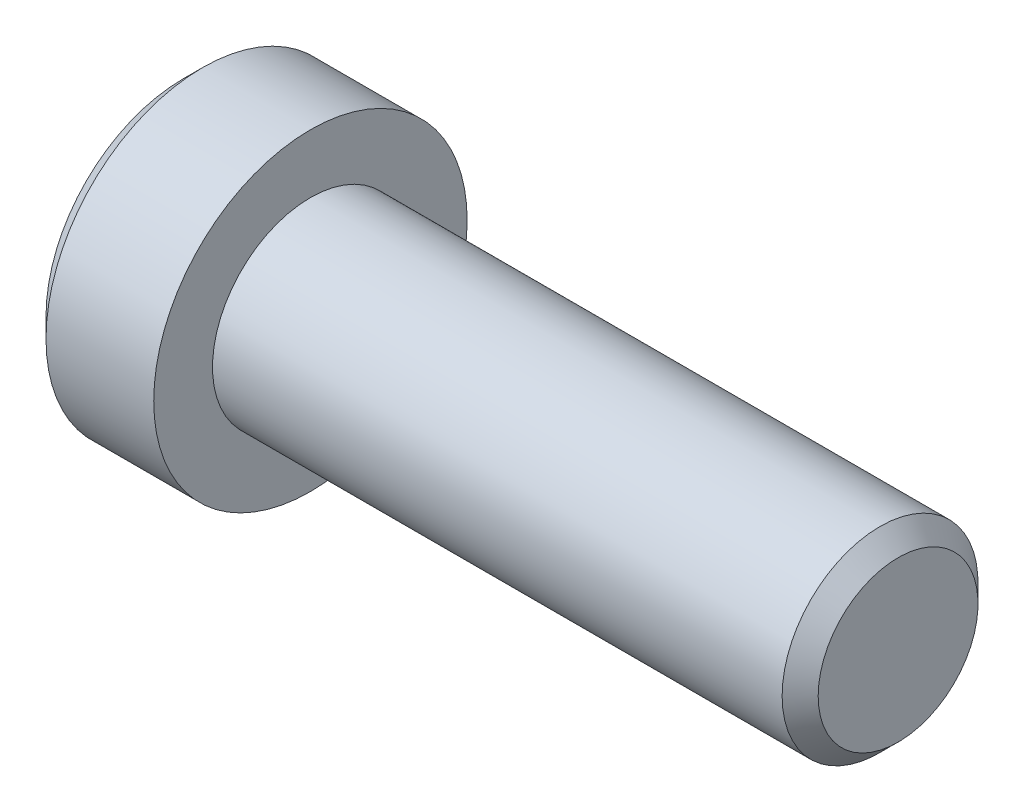
ISO-10303-21;
HEADER;
FILE_DESCRIPTION(('STEP AP214'),'2;1');
FILE_NAME('part.step','',(''),(''),'','','');
FILE_SCHEMA(('AUTOMOTIVE_DESIGN { 1 0 10303 214 1 1 1 1 }'));
ENDSEC;
DATA;
#1=APPLICATION_CONTEXT('core data for automotive mechanical design processes');
#2=APPLICATION_PROTOCOL_DEFINITION('international standard','automotive_design',2000,#1);
#3=PRODUCT_CONTEXT('',#1,'mechanical');
#4=PRODUCT('Part','Part','',(#3));
#5=PRODUCT_RELATED_PRODUCT_CATEGORY('part','',(#4));
#6=PRODUCT_DEFINITION_FORMATION('','',#4);
#7=PRODUCT_DEFINITION_CONTEXT('part definition',#1,'design');
#8=PRODUCT_DEFINITION('design','',#6,#7);
#9=PRODUCT_DEFINITION_SHAPE('','',#8);
#10=(LENGTH_UNIT() NAMED_UNIT(*) SI_UNIT(.MILLI.,.METRE.));
#11=(NAMED_UNIT(*) PLANE_ANGLE_UNIT() SI_UNIT($,.RADIAN.));
#12=(NAMED_UNIT(*) SI_UNIT($,.STERADIAN.) SOLID_ANGLE_UNIT());
#13=UNCERTAINTY_MEASURE_WITH_UNIT(LENGTH_MEASURE(1.E-05),#10,'distance_accuracy_value','');
#14=(GEOMETRIC_REPRESENTATION_CONTEXT(3) GLOBAL_UNCERTAINTY_ASSIGNED_CONTEXT((#13)) GLOBAL_UNIT_ASSIGNED_CONTEXT((#10,
#11,#12)) REPRESENTATION_CONTEXT('',''));
#15=CARTESIAN_POINT('',(0.,0.,0.));
#16=DIRECTION('',(0.,0.,1.));
#17=DIRECTION('',(1.,0.,0.));
#18=AXIS2_PLACEMENT_3D('',#15,#16,#17);
#19=CARTESIAN_POINT('',(0.999999999976353,0.,0.));
#20=DIRECTION('',(-1.,0.,0.));
#21=DIRECTION('',(0.,0.,1.));
#22=AXIS2_PLACEMENT_3D('',#19,#20,#21);
#23=CONICAL_SURFACE('',#22,2.50000000005457,1.04719755117819);
#24=CARTESIAN_POINT('',(2.44337567301045,-5.6843418860808E-11,0.));
#25=VERTEX_POINT('',#24);
#26=VERTEX_LOOP('',#25);
#27=FACE_BOUND('',#26,.T.);
#28=CARTESIAN_POINT('',(1.,0.,0.));
#29=DIRECTION('',(1.,0.,0.));
#30=DIRECTION('',(0.,1.,0.));
#31=AXIS2_PLACEMENT_3D('',#28,#29,#30);
#32=CIRCLE('',#31,2.5);
#33=CARTESIAN_POINT('',(1.,2.5,0.));
#34=VERTEX_POINT('',#33);
#35=EDGE_CURVE('E107',#34,#34,#32,.F.);
#36=ORIENTED_EDGE('',*,*,#35,.T.);
#37=EDGE_LOOP('',(#36));
#38=FACE_BOUND('',#37,.T.);
#39=ADVANCED_FACE('F17',(#27,#38),#23,.F.);
#40=CARTESIAN_POINT('',(-0.388354503153696,0.,0.));
#41=DIRECTION('',(1.,0.,0.));
#42=DIRECTION('',(0.,1.,0.));
#43=AXIS2_PLACEMENT_3D('',#40,#41,#42);
#44=CYLINDRICAL_SURFACE('',#43,2.5);
#45=ORIENTED_EDGE('',*,*,#35,.F.);
#46=EDGE_LOOP('',(#45));
#47=FACE_BOUND('',#46,.T.);
#48=CARTESIAN_POINT('',(-1.77670900626481,0.,0.));
#49=DIRECTION('',(-1.,0.,0.));
#50=DIRECTION('',(0.,1.,0.));
#51=AXIS2_PLACEMENT_3D('',#48,#49,#50);
#52=CIRCLE('',#51,2.49999999999773);
#53=CARTESIAN_POINT('',(-1.77670900626481,2.49999999999773,0.));
#54=VERTEX_POINT('',#53);
#55=EDGE_CURVE('E85',#54,#54,#52,.T.);
#56=ORIENTED_EDGE('',*,*,#55,.T.);
#57=EDGE_LOOP('',(#56));
#58=FACE_BOUND('',#57,.T.);
#59=ADVANCED_FACE('F170',(#47,#58),#44,.F.);
#60=CARTESIAN_POINT('',(-3.00733974592049,0.,0.));
#61=DIRECTION('',(-1.,0.,0.));
#62=DIRECTION('',(0.,0.,1.));
#63=AXIS2_PLACEMENT_3D('',#60,#61,#62);
#64=CONICAL_SURFACE('',#63,4.63151496643377,1.04719755119585);
#65=ORIENTED_EDGE('',*,*,#55,.F.);
#66=EDGE_LOOP('',(#65));
#67=FACE_BOUND('',#66,.T.);
#68=CARTESIAN_POINT('',(-2.99999999996384,4.,2.30940107676894));
#69=CARTESIAN_POINT('',(-2.94139109021679,4.,2.10643269459662));
#70=CARTESIAN_POINT('',(-2.88808935416355,4.,1.90171229223685));
#71=CARTESIAN_POINT('',(-2.79505277476292,4.,1.48872689069175));
#72=CARTESIAN_POINT('',(-2.75535084063822,4.,1.28045455594373));
#73=CARTESIAN_POINT('',(-2.69355191785354,4.,0.866490901087552));
#74=CARTESIAN_POINT('',(-2.67104357515487,4.,0.660863256751594));
#75=CARTESIAN_POINT('',(-2.64417833622137,4.,0.248640926862069));
#76=CARTESIAN_POINT('',(-2.63979918790862,4.,0.0420477385965077));
#77=CARTESIAN_POINT('',(-2.64893258026943,4.,-0.343949470895996));
#78=CARTESIAN_POINT('',(-2.66020257039234,4.,-0.523411414148852));
#79=CARTESIAN_POINT('',(-2.69591460139636,4.,-0.881166164633634));
#80=CARTESIAN_POINT('',(-2.72036882949761,4.,-1.05945773541097));
#81=CARTESIAN_POINT('',(-2.78149966663764,4.,-1.41794949442067));
#82=CARTESIAN_POINT('',(-2.81843528439806,4.,-1.59810433357154));
#83=CARTESIAN_POINT('',(-2.90226352164124,4.,-1.95572777959508));
#84=CARTESIAN_POINT('',(-2.94913645746758,4.,-2.13320096450319));
#85=CARTESIAN_POINT('',(-2.99999999996384,4.,-2.30940107676893));
#86=B_SPLINE_CURVE_WITH_KNOTS('',3,(#68,#69,#70,#71,#72,#73,#74,#75,#76,#77,#78,#79,#80,#81,#82,
#83,#84,#85),.UNSPECIFIED.,.F.,.F.,(4,2,2,2,2,2,2,2,4),(0.,0.634032023114607,1.26958763405604,
1.88941521230844,2.508481777799,3.04741556527165,3.5868483876012,4.13824324499452,
4.68855594705187),.UNSPECIFIED.);
#87=CARTESIAN_POINT('',(-2.99999999996384,4.00000000000452,2.30940107676112));
#88=VERTEX_POINT('',#87);
#89=CARTESIAN_POINT('',(-2.99999999996233,4.,-2.30940107676372));
#90=VERTEX_POINT('',#89);
#91=EDGE_CURVE('E20',#88,#90,#86,.T.);
#92=ORIENTED_EDGE('',*,*,#91,.T.);
#93=CARTESIAN_POINT('',(-2.99999999996384,4.00000000000904,-2.30940107675328));
#94=CARTESIAN_POINT('',(-2.94139109021679,3.82422422488277,-2.41088526783945));
#95=CARTESIAN_POINT('',(-2.88808935416355,3.64693115576625,-2.51324546901933));
#96=CARTESIAN_POINT('',(-2.79505277476292,3.28927530663608,-2.71973816979188));
#97=CARTESIAN_POINT('',(-2.75535084063822,3.10890617383879,-2.82387433716589));
#98=CARTESIAN_POINT('',(-2.69355191785354,2.75040313248989,-3.03085616459398));
#99=CARTESIAN_POINT('',(-2.67104357515487,2.5723243687746,-3.13366998676196));
#100=CARTESIAN_POINT('',(-2.64417833622137,2.21532935908306,-3.33978115170672));
#101=CARTESIAN_POINT('',(-2.63979918790862,2.03641440979626,-3.4430777458395));
#102=CARTESIAN_POINT('',(-2.64893258026943,1.70213102058585,-3.63607635058575));
#103=CARTESIAN_POINT('',(-2.66020257039234,1.54671241871635,-3.72580732221218));
#104=CARTESIAN_POINT('',(-2.69591460139635,1.23688771647197,-3.90468469745457));
#105=CARTESIAN_POINT('',(-2.72036882949761,1.08248268689816,-3.99383048284324));
#106=CARTESIAN_POINT('',(-2.78149966663764,0.772019716548399,-4.17307636234809));
#107=CARTESIAN_POINT('',(-2.81843528439805,0.616001049229039,-4.26315378192353));
#108=CARTESIAN_POINT('',(-2.90226352164124,0.306290059983726,-4.44196550493529));
#109=CARTESIAN_POINT('',(-2.94913645746758,0.152593773362769,-4.53070209738935));
#110=CARTESIAN_POINT('',(-2.99999999996384,-9.03866747885076E-12,-4.61880215352222));
#111=B_SPLINE_CURVE_WITH_KNOTS('',3,(#93,#94,#95,#96,#97,#98,#99,#100,#101,#102,#103,#104,#105,
#106,#107,#108,#109,#110),.UNSPECIFIED.,.F.,.F.,(4,2,2,2,2,2,2,2,4),(0.,0.634032023114606,
1.26958763405604,1.88941521230844,2.508481777799,3.04741556527165,3.5868483876012,
4.13824324499452,4.68855594705187),.UNSPECIFIED.);
#112=CARTESIAN_POINT('',(-2.99999999996384,0.,-4.61880215352223));
#113=VERTEX_POINT('',#112);
#114=EDGE_CURVE('E112',#90,#113,#111,.T.);
#115=ORIENTED_EDGE('',*,*,#114,.T.);
#116=CARTESIAN_POINT('',(-2.99999999996384,9.03659718403956E-12,-4.61880215352223));
#117=CARTESIAN_POINT('',(-2.94139109021679,-0.175775775117229,-4.51731796243606));
#118=CARTESIAN_POINT('',(-2.88808935416355,-0.353068844233756,-4.41495776125618));
#119=CARTESIAN_POINT('',(-2.79505277476292,-0.710724693363928,-4.20846506048363));
#120=CARTESIAN_POINT('',(-2.75535084063822,-0.891093826161209,-4.10432889310962));
#121=CARTESIAN_POINT('',(-2.69355191785354,-1.24959686751012,-3.89734706568153));
#122=CARTESIAN_POINT('',(-2.67104357515487,-1.42767563122541,-3.79453324351355));
#123=CARTESIAN_POINT('',(-2.64417833622137,-1.78467064091695,-3.58842207856879));
#124=CARTESIAN_POINT('',(-2.63979918790862,-1.96358559020374,-3.48512548443601));
#125=CARTESIAN_POINT('',(-2.64893258026943,-2.29786897941416,-3.29212687968976));
#126=CARTESIAN_POINT('',(-2.66020257039235,-2.45328758128365,-3.20239590806333));
#127=CARTESIAN_POINT('',(-2.69591460139636,-2.76311228352803,-3.02351853282094));
#128=CARTESIAN_POINT('',(-2.72036882949761,-2.91751731310184,-2.93437274743227));
#129=CARTESIAN_POINT('',(-2.78149966663764,-3.2279802834516,-2.75512686792742));
#130=CARTESIAN_POINT('',(-2.81843528439806,-3.38399895077096,-2.66504944835198));
#131=CARTESIAN_POINT('',(-2.90226352164124,-3.69370994001628,-2.48623772534022));
#132=CARTESIAN_POINT('',(-2.94913645746758,-3.84740622663723,-2.39750113288616));
#133=CARTESIAN_POINT('',(-2.99999999996384,-4.00000000000904,-2.30940107675329));
#134=B_SPLINE_CURVE_WITH_KNOTS('',3,(#116,#117,#118,#119,#120,#121,#122,#123,#124,#125,#126,
#127,#128,#129,#130,#131,#132,#133),.UNSPECIFIED.,.F.,.F.,(4,2,2,2,2,2,2,2,4),(0.,
0.634032023114607,1.26958763405604,1.88941521230844,2.508481777799,3.04741556527165,
3.5868483876012,4.13824324499452,4.68855594705187),.UNSPECIFIED.);
#135=CARTESIAN_POINT('',(-2.99999999996384,-4.00000000000452,-2.30940107676111));
#136=VERTEX_POINT('',#135);
#137=EDGE_CURVE('E159',#113,#136,#134,.T.);
#138=ORIENTED_EDGE('',*,*,#137,.T.);
#139=CARTESIAN_POINT('',(-2.99999999996384,-4.,-2.30940107676894));
#140=CARTESIAN_POINT('',(-2.94139109021678,-4.,-2.10643269459661));
#141=CARTESIAN_POINT('',(-2.88808935416355,-4.,-1.90171229223685));
#142=CARTESIAN_POINT('',(-2.79505277476292,-4.,-1.48872689069175));
#143=CARTESIAN_POINT('',(-2.75535084063822,-4.,-1.28045455594373));
#144=CARTESIAN_POINT('',(-2.69355191785354,-4.,-0.866490901087547));
#145=CARTESIAN_POINT('',(-2.67104357515487,-4.,-0.66086325675159));
#146=CARTESIAN_POINT('',(-2.64417833622137,-4.,-0.248640926862065));
#147=CARTESIAN_POINT('',(-2.63979918790862,-4.,-0.0420477385965033));
#148=CARTESIAN_POINT('',(-2.64893258026943,-4.,0.343949470896));
#149=CARTESIAN_POINT('',(-2.66020257039234,-4.,0.523411414148856));
#150=CARTESIAN_POINT('',(-2.69591460139635,-4.,0.881166164633637));
#151=CARTESIAN_POINT('',(-2.72036882949761,-4.,1.05945773541097));
#152=CARTESIAN_POINT('',(-2.78149966663764,-4.,1.41794949442067));
#153=CARTESIAN_POINT('',(-2.81843528439805,-4.,1.59810433357154));
#154=CARTESIAN_POINT('',(-2.90226352164124,-4.,1.95572777959508));
#155=CARTESIAN_POINT('',(-2.94913645746757,-4.,2.13320096450319));
#156=CARTESIAN_POINT('',(-2.99999999996384,-4.,2.30940107676893));
#157=B_SPLINE_CURVE_WITH_KNOTS('',3,(#139,#140,#141,#142,#143,#144,#145,#146,#147,#148,#149,
#150,#151,#152,#153,#154,#155,#156),.UNSPECIFIED.,.F.,.F.,(4,2,2,2,2,2,2,2,4),(0.,
0.634032023114606,1.26958763405604,1.88941521230844,2.508481777799,3.04741556527165,
3.58684838760119,4.13824324499451,4.68855594705186),.UNSPECIFIED.);
#158=CARTESIAN_POINT('',(-2.99999999996384,-4.00000000000452,2.30940107676111));
#159=VERTEX_POINT('',#158);
#160=EDGE_CURVE('E183',#136,#159,#157,.T.);
#161=ORIENTED_EDGE('',*,*,#160,.T.);
#162=CARTESIAN_POINT('',(-2.99999999996384,-4.00000000000904,2.30940107675328));
#163=CARTESIAN_POINT('',(-2.94139109021678,-3.82422422488277,2.41088526783945));
#164=CARTESIAN_POINT('',(-2.88808935416355,-3.64693115576625,2.51324546901933));
#165=CARTESIAN_POINT('',(-2.79505277476292,-3.28927530663607,2.71973816979188));
#166=CARTESIAN_POINT('',(-2.75535084063822,-3.10890617383879,2.82387433716589));
#167=CARTESIAN_POINT('',(-2.69355191785354,-2.75040313248989,3.03085616459398));
#168=CARTESIAN_POINT('',(-2.67104357515487,-2.5723243687746,3.13366998676196));
#169=CARTESIAN_POINT('',(-2.64417833622137,-2.21532935908306,3.33978115170672));
#170=CARTESIAN_POINT('',(-2.63979918790862,-2.03641440979626,3.4430777458395));
#171=CARTESIAN_POINT('',(-2.64893258026943,-1.70213102058585,3.63607635058575));
#172=CARTESIAN_POINT('',(-2.66020257039234,-1.54671241871635,3.72580732221218));
#173=CARTESIAN_POINT('',(-2.69591460139635,-1.23688771647197,3.90468469745457));
#174=CARTESIAN_POINT('',(-2.72036882949761,-1.08248268689816,3.99383048284324));
#175=CARTESIAN_POINT('',(-2.78149966663764,-0.772019716548397,4.17307636234809));
#176=CARTESIAN_POINT('',(-2.81843528439805,-0.616001049229037,4.26315378192353));
#177=CARTESIAN_POINT('',(-2.90226352164124,-0.306290059983724,4.44196550493529));
#178=CARTESIAN_POINT('',(-2.94913645746758,-0.152593773362767,4.53070209738935));
#179=CARTESIAN_POINT('',(-2.99999999996384,9.04046564155441E-12,4.61880215352222));
#180=B_SPLINE_CURVE_WITH_KNOTS('',3,(#162,#163,#164,#165,#166,#167,#168,#169,#170,#171,#172,
#173,#174,#175,#176,#177,#178,#179),.UNSPECIFIED.,.F.,.F.,(4,2,2,2,2,2,2,2,4),(0.,
0.634032023114606,1.26958763405604,1.88941521230844,2.508481777799,3.04741556527165,
3.5868483876012,4.13824324499452,4.68855594705187),.UNSPECIFIED.);
#181=CARTESIAN_POINT('',(-2.99999999996384,0.,4.61880215352222));
#182=VERTEX_POINT('',#181);
#183=EDGE_CURVE('E90',#159,#182,#180,.T.);
#184=ORIENTED_EDGE('',*,*,#183,.T.);
#185=CARTESIAN_POINT('',(-2.99999999996384,-9.03399706389796E-12,4.61880215352223));
#186=CARTESIAN_POINT('',(-2.94139109021679,0.175775775117231,4.51731796243606));
#187=CARTESIAN_POINT('',(-2.88808935416355,0.353068844233757,4.41495776125618));
#188=CARTESIAN_POINT('',(-2.79505277476292,0.71072469336393,4.20846506048363));
#189=CARTESIAN_POINT('',(-2.75535084063822,0.891093826161211,4.10432889310962));
#190=CARTESIAN_POINT('',(-2.69355191785354,1.24959686751012,3.89734706568153));
#191=CARTESIAN_POINT('',(-2.67104357515487,1.42767563122541,3.79453324351355));
#192=CARTESIAN_POINT('',(-2.64417833622137,1.78467064091695,3.58842207856879));
#193=CARTESIAN_POINT('',(-2.63979918790863,1.96358559020374,3.48512548443601));
#194=CARTESIAN_POINT('',(-2.64893258026943,2.29786897941416,3.29212687968976));
#195=CARTESIAN_POINT('',(-2.66020257039235,2.45328758128365,3.20239590806333));
#196=CARTESIAN_POINT('',(-2.69591460139636,2.76311228352803,3.02351853282094));
#197=CARTESIAN_POINT('',(-2.72036882949761,2.91751731310184,2.93437274743227));
#198=CARTESIAN_POINT('',(-2.78149966663764,3.2279802834516,2.75512686792742));
#199=CARTESIAN_POINT('',(-2.81843528439806,3.38399895077096,2.66504944835198));
#200=CARTESIAN_POINT('',(-2.90226352164124,3.69370994001627,2.48623772534022));
#201=CARTESIAN_POINT('',(-2.94913645746758,3.84740622663723,2.39750113288616));
#202=CARTESIAN_POINT('',(-2.99999999996384,4.00000000000904,2.30940107675329));
#203=B_SPLINE_CURVE_WITH_KNOTS('',3,(#185,#186,#187,#188,#189,#190,#191,#192,#193,#194,#195,
#196,#197,#198,#199,#200,#201,#202),.UNSPECIFIED.,.F.,.F.,(4,2,2,2,2,2,2,2,4),(0.,
0.634032023114606,1.26958763405604,1.88941521230844,2.508481777799,3.04741556527165,
3.58684838760119,4.13824324499452,4.68855594705186),.UNSPECIFIED.);
#204=EDGE_CURVE('E87',#182,#88,#203,.T.);
#205=ORIENTED_EDGE('',*,*,#204,.T.);
#206=EDGE_LOOP('',(#92,#115,#138,#161,#184,#205));
#207=FACE_BOUND('',#206,.T.);
#208=ADVANCED_FACE('F88',(#67,#207),#64,.F.);
#209=CARTESIAN_POINT('',(-6.5,4.,2.3094010767585));
#210=DIRECTION('',(0.,1.,0.));
#211=DIRECTION('',(0.,0.,1.));
#212=AXIS2_PLACEMENT_3D('',#209,#210,#211);
#213=PLANE('',#212);
#214=DIRECTION('',(1.,0.,0.));
#215=VECTOR('',#214,1.);
#216=CARTESIAN_POINT('',(-6.5,4.,2.30940107675851));
#217=LINE('',#216,#215);
#218=CARTESIAN_POINT('',(-6.5,4.,2.3094010767585));
#219=VERTEX_POINT('',#218);
#220=EDGE_CURVE('E78',#88,#219,#217,.F.);
#221=ORIENTED_EDGE('',*,*,#220,.T.);
#222=DIRECTION('',(0.,0.,1.));
#223=VECTOR('',#222,1.);
#224=CARTESIAN_POINT('',(-6.5,4.,0.));
#225=LINE('',#224,#223);
#226=CARTESIAN_POINT('',(-6.5,4.,-2.3094010767585));
#227=VERTEX_POINT('',#226);
#228=EDGE_CURVE('E110',#227,#219,#225,.T.);
#229=ORIENTED_EDGE('',*,*,#228,.F.);
#230=DIRECTION('',(1.,0.,0.));
#231=VECTOR('',#230,1.);
#232=CARTESIAN_POINT('',(-6.5,4.,-2.3094010767585));
#233=LINE('',#232,#231);
#234=EDGE_CURVE('E81',#227,#90,#233,.T.);
#235=ORIENTED_EDGE('',*,*,#234,.T.);
#236=ORIENTED_EDGE('',*,*,#91,.F.);
#237=EDGE_LOOP('',(#221,#229,#235,#236));
#238=FACE_BOUND('',#237,.T.);
#239=ADVANCED_FACE('F75',(#238),#213,.F.);
#240=CARTESIAN_POINT('',(-6.5,0.,4.61880215351701));
#241=DIRECTION('',(0.,0.5,0.866025403784439));
#242=DIRECTION('',(0.,-0.866025403784439,0.5));
#243=AXIS2_PLACEMENT_3D('',#240,#241,#242);
#244=PLANE('',#243);
#245=DIRECTION('',(1.,0.,0.));
#246=VECTOR('',#245,1.);
#247=CARTESIAN_POINT('',(-6.5,0.,4.618802153517));
#248=LINE('',#247,#246);
#249=CARTESIAN_POINT('',(-6.5,0.,4.61880215351701));
#250=VERTEX_POINT('',#249);
#251=EDGE_CURVE('E93',#182,#250,#248,.F.);
#252=ORIENTED_EDGE('',*,*,#251,.T.);
#253=DIRECTION('',(0.,-0.866025403784438,0.500000000000001));
#254=VECTOR('',#253,1.);
#255=CARTESIAN_POINT('',(-6.5,4.,2.3094010767585));
#256=LINE('',#255,#254);
#257=EDGE_CURVE('E96',#219,#250,#256,.T.);
#258=ORIENTED_EDGE('',*,*,#257,.F.);
#259=ORIENTED_EDGE('',*,*,#220,.F.);
#260=ORIENTED_EDGE('',*,*,#204,.F.);
#261=EDGE_LOOP('',(#252,#258,#259,#260));
#262=FACE_BOUND('',#261,.T.);
#263=ADVANCED_FACE('F94',(#262),#244,.F.);
#264=CARTESIAN_POINT('',(-6.5,-4.,2.3094010767585));
#265=DIRECTION('',(0.,-0.5,0.866025403784439));
#266=DIRECTION('',(0.,-0.866025403784439,-0.5));
#267=AXIS2_PLACEMENT_3D('',#264,#265,#266);
#268=PLANE('',#267);
#269=DIRECTION('',(1.,0.,0.));
#270=VECTOR('',#269,1.);
#271=CARTESIAN_POINT('',(-6.5,-4.,2.3094010767585));
#272=LINE('',#271,#270);
#273=CARTESIAN_POINT('',(-6.5,-4.,2.3094010767585));
#274=VERTEX_POINT('',#273);
#275=EDGE_CURVE('E192',#159,#274,#272,.F.);
#276=ORIENTED_EDGE('',*,*,#275,.T.);
#277=DIRECTION('',(0.,-0.866025403784438,-0.500000000000001));
#278=VECTOR('',#277,1.);
#279=CARTESIAN_POINT('',(-6.5,0.,4.61880215351701));
#280=LINE('',#279,#278);
#281=EDGE_CURVE('E129',#250,#274,#280,.T.);
#282=ORIENTED_EDGE('',*,*,#281,.F.);
#283=ORIENTED_EDGE('',*,*,#251,.F.);
#284=ORIENTED_EDGE('',*,*,#183,.F.);
#285=EDGE_LOOP('',(#276,#282,#283,#284));
#286=FACE_BOUND('',#285,.T.);
#287=ADVANCED_FACE('F193',(#286),#268,.F.);
#288=CARTESIAN_POINT('',(-6.5,-4.,-2.3094010767585));
#289=DIRECTION('',(0.,-1.,0.));
#290=DIRECTION('',(0.,0.,-1.));
#291=AXIS2_PLACEMENT_3D('',#288,#289,#290);
#292=PLANE('',#291);
#293=DIRECTION('',(1.,0.,0.));
#294=VECTOR('',#293,1.);
#295=CARTESIAN_POINT('',(-6.5,-4.,-2.30940107675851));
#296=LINE('',#295,#294);
#297=CARTESIAN_POINT('',(-6.5,-4.,-2.3094010767585));
#298=VERTEX_POINT('',#297);
#299=EDGE_CURVE('E258',#136,#298,#296,.F.);
#300=ORIENTED_EDGE('',*,*,#299,.T.);
#301=DIRECTION('',(0.,0.,1.));
#302=VECTOR('',#301,1.);
#303=CARTESIAN_POINT('',(-6.5,-4.,0.));
#304=LINE('',#303,#302);
#305=EDGE_CURVE('E124',#274,#298,#304,.F.);
#306=ORIENTED_EDGE('',*,*,#305,.F.);
#307=ORIENTED_EDGE('',*,*,#275,.F.);
#308=ORIENTED_EDGE('',*,*,#160,.F.);
#309=EDGE_LOOP('',(#300,#306,#307,#308));
#310=FACE_BOUND('',#309,.T.);
#311=ADVANCED_FACE('F196',(#310),#292,.F.);
#312=CARTESIAN_POINT('',(-6.5,0.,-4.61880215351701));
#313=DIRECTION('',(0.,-0.5,-0.866025403784439));
#314=DIRECTION('',(0.,0.866025403784439,-0.5));
#315=AXIS2_PLACEMENT_3D('',#312,#313,#314);
#316=PLANE('',#315);
#317=DIRECTION('',(1.,0.,0.));
#318=VECTOR('',#317,1.);
#319=CARTESIAN_POINT('',(-6.5,0.,-4.61880215351701));
#320=LINE('',#319,#318);
#321=CARTESIAN_POINT('',(-6.5,0.,-4.61880215351701));
#322=VERTEX_POINT('',#321);
#323=EDGE_CURVE('E40',#113,#322,#320,.F.);
#324=ORIENTED_EDGE('',*,*,#323,.T.);
#325=DIRECTION('',(0.,0.866025403784438,-0.500000000000001));
#326=VECTOR('',#325,1.);
#327=CARTESIAN_POINT('',(-6.5,-4.,-2.3094010767585));
#328=LINE('',#327,#326);
#329=EDGE_CURVE('E119',#298,#322,#328,.T.);
#330=ORIENTED_EDGE('',*,*,#329,.F.);
#331=ORIENTED_EDGE('',*,*,#299,.F.);
#332=ORIENTED_EDGE('',*,*,#137,.F.);
#333=EDGE_LOOP('',(#324,#330,#331,#332));
#334=FACE_BOUND('',#333,.T.);
#335=ADVANCED_FACE('F238',(#334),#316,.F.);
#336=CARTESIAN_POINT('',(-6.5,4.,-2.3094010767585));
#337=DIRECTION('',(0.,0.5,-0.866025403784438));
#338=DIRECTION('',(0.,0.866025403784438,0.5));
#339=AXIS2_PLACEMENT_3D('',#336,#337,#338);
#340=PLANE('',#339);
#341=ORIENTED_EDGE('',*,*,#234,.F.);
#342=DIRECTION('',(0.,0.866025403784438,0.500000000000001));
#343=VECTOR('',#342,1.);
#344=CARTESIAN_POINT('',(-6.5,0.,-4.61880215351701));
#345=LINE('',#344,#343);
#346=EDGE_CURVE('E115',#322,#227,#345,.T.);
#347=ORIENTED_EDGE('',*,*,#346,.F.);
#348=ORIENTED_EDGE('',*,*,#323,.F.);
#349=ORIENTED_EDGE('',*,*,#114,.F.);
#350=EDGE_LOOP('',(#341,#347,#348,#349));
#351=FACE_BOUND('',#350,.T.);
#352=ADVANCED_FACE('F165',(#351),#340,.F.);
#353=CARTESIAN_POINT('',(-6.5,6.3094010767585,0.));
#354=DIRECTION('',(-1.,0.,0.));
#355=DIRECTION('',(0.,-1.,0.));
#356=AXIS2_PLACEMENT_3D('',#353,#354,#355);
#357=PLANE('',#356);
#358=ORIENTED_EDGE('',*,*,#329,.T.);
#359=ORIENTED_EDGE('',*,*,#346,.T.);
#360=ORIENTED_EDGE('',*,*,#228,.T.);
#361=ORIENTED_EDGE('',*,*,#257,.T.);
#362=ORIENTED_EDGE('',*,*,#281,.T.);
#363=ORIENTED_EDGE('',*,*,#305,.T.);
#364=EDGE_LOOP('',(#358,#359,#360,#361,#362,#363));
#365=FACE_BOUND('',#364,.T.);
#366=CARTESIAN_POINT('',(-6.49999999999872,0.,0.));
#367=DIRECTION('',(1.,0.,0.));
#368=DIRECTION('',(0.,0.,-1.));
#369=AXIS2_PLACEMENT_3D('',#366,#367,#368);
#370=CIRCLE('',#369,6.99999999999872);
#371=CARTESIAN_POINT('',(-6.49999999999872,0.,-6.99999999999872));
#372=VERTEX_POINT('',#371);
#373=EDGE_CURVE('E118',#372,#372,#370,.T.);
#374=ORIENTED_EDGE('',*,*,#373,.F.);
#375=EDGE_LOOP('',(#374));
#376=FACE_BOUND('',#375,.T.);
#377=ADVANCED_FACE('F231',(#365,#376),#357,.T.);
#378=CARTESIAN_POINT('',(-5.50000000000128,0.,0.));
#379=DIRECTION('',(1.,0.,0.));
#380=DIRECTION('',(0.,0.,-1.));
#381=AXIS2_PLACEMENT_3D('',#378,#379,#380);
#382=CONICAL_SURFACE('',#381,8.00000000000128,0.7853981634);
#383=ORIENTED_EDGE('',*,*,#373,.T.);
#384=EDGE_LOOP('',(#383));
#385=FACE_BOUND('',#384,.T.);
#386=CARTESIAN_POINT('',(-5.5,0.,0.));
#387=DIRECTION('',(1.,0.,0.));
#388=DIRECTION('',(0.,1.,0.));
#389=AXIS2_PLACEMENT_3D('',#386,#387,#388);
#390=CIRCLE('',#389,8.);
#391=CARTESIAN_POINT('',(-5.5,8.,0.));
#392=VERTEX_POINT('',#391);
#393=EDGE_CURVE('E151',#392,#392,#390,.T.);
#394=ORIENTED_EDGE('',*,*,#393,.F.);
#395=EDGE_LOOP('',(#394));
#396=FACE_BOUND('',#395,.T.);
#397=ADVANCED_FACE('F228',(#385,#396),#382,.T.);
#398=CARTESIAN_POINT('',(-3.25,0.,0.));
#399=DIRECTION('',(1.,0.,0.));
#400=DIRECTION('',(0.,1.,0.));
#401=AXIS2_PLACEMENT_3D('',#398,#399,#400);
#402=CYLINDRICAL_SURFACE('',#401,8.);
#403=CARTESIAN_POINT('',(0.,0.,0.));
#404=DIRECTION('',(1.,0.,0.));
#405=DIRECTION('',(0.,1.,0.));
#406=AXIS2_PLACEMENT_3D('',#403,#404,#405);
#407=CIRCLE('',#406,8.);
#408=CARTESIAN_POINT('',(0.,8.,0.));
#409=VERTEX_POINT('',#408);
#410=EDGE_CURVE('E148',#409,#409,#407,.T.);
#411=ORIENTED_EDGE('',*,*,#410,.F.);
#412=EDGE_LOOP('',(#411));
#413=FACE_BOUND('',#412,.T.);
#414=ORIENTED_EDGE('',*,*,#393,.T.);
#415=EDGE_LOOP('',(#414));
#416=FACE_BOUND('',#415,.T.);
#417=ADVANCED_FACE('F224',(#413,#416),#402,.T.);
#418=CARTESIAN_POINT('',(30.,2.5,0.));
#419=DIRECTION('',(1.,0.,0.));
#420=DIRECTION('',(0.,1.,0.));
#421=AXIS2_PLACEMENT_3D('',#418,#419,#420);
#422=PLANE('',#421);
#423=CARTESIAN_POINT('',(30.0000000000296,0.,0.));
#424=DIRECTION('',(-1.,0.,0.));
#425=DIRECTION('',(0.,0.,1.));
#426=AXIS2_PLACEMENT_3D('',#423,#424,#425);
#427=CIRCLE('',#426,4.0798250000762);
#428=CARTESIAN_POINT('',(30.0000000000296,0.,4.0798250000762));
#429=VERTEX_POINT('',#428);
#430=EDGE_CURVE('E145',#429,#429,#427,.T.);
#431=ORIENTED_EDGE('',*,*,#430,.F.);
#432=EDGE_LOOP('',(#431));
#433=FACE_BOUND('',#432,.T.);
#434=ADVANCED_FACE('F220',(#433),#422,.T.);
#435=CARTESIAN_POINT('',(0.,6.5,0.));
#436=DIRECTION('',(1.,0.,0.));
#437=DIRECTION('',(0.,1.,0.));
#438=AXIS2_PLACEMENT_3D('',#435,#436,#437);
#439=PLANE('',#438);
#440=CARTESIAN_POINT('',(0.,0.,0.));
#441=DIRECTION('',(1.,0.,0.));
#442=DIRECTION('',(0.,1.,0.));
#443=AXIS2_PLACEMENT_3D('',#440,#441,#442);
#444=CIRCLE('',#443,5.);
#445=CARTESIAN_POINT('',(0.,5.,0.));
#446=VERTEX_POINT('',#445);
#447=EDGE_CURVE('E31',#446,#446,#444,.T.);
#448=ORIENTED_EDGE('',*,*,#447,.F.);
#449=EDGE_LOOP('',(#448));
#450=FACE_BOUND('',#449,.T.);
#451=ORIENTED_EDGE('',*,*,#410,.T.);
#452=EDGE_LOOP('',(#451));
#453=FACE_BOUND('',#452,.T.);
#454=ADVANCED_FACE('F213',(#450,#453),#439,.T.);
#455=CARTESIAN_POINT('',(29.0798249999398,0.,0.));
#456=DIRECTION('',(-1.,0.,0.));
#457=DIRECTION('',(0.,0.,1.));
#458=AXIS2_PLACEMENT_3D('',#455,#456,#457);
#459=CONICAL_SURFACE('',#458,5.00000000016598,0.785398163397448);
#460=ORIENTED_EDGE('',*,*,#430,.T.);
#461=EDGE_LOOP('',(#460));
#462=FACE_BOUND('',#461,.T.);
#463=CARTESIAN_POINT('',(29.079825,0.,0.));
#464=DIRECTION('',(1.,0.,0.));
#465=DIRECTION('',(0.,1.,0.));
#466=AXIS2_PLACEMENT_3D('',#463,#464,#465);
#467=CIRCLE('',#466,5.);
#468=CARTESIAN_POINT('',(29.079825,5.,0.));
#469=VERTEX_POINT('',#468);
#470=EDGE_CURVE('E11',#469,#469,#467,.F.);
#471=ORIENTED_EDGE('',*,*,#470,.F.);
#472=EDGE_LOOP('',(#471));
#473=FACE_BOUND('',#472,.T.);
#474=ADVANCED_FACE('F207',(#462,#473),#459,.T.);
#475=CARTESIAN_POINT('',(15.,0.,0.));
#476=DIRECTION('',(1.,0.,0.));
#477=DIRECTION('',(0.,1.,0.));
#478=AXIS2_PLACEMENT_3D('',#475,#476,#477);
#479=CYLINDRICAL_SURFACE('',#478,5.);
#480=ORIENTED_EDGE('',*,*,#470,.T.);
#481=EDGE_LOOP('',(#480));
#482=FACE_BOUND('',#481,.T.);
#483=ORIENTED_EDGE('',*,*,#447,.T.);
#484=EDGE_LOOP('',(#483));
#485=FACE_BOUND('',#484,.T.);
#486=ADVANCED_FACE('F205',(#482,#485),#479,.T.);
#487=CLOSED_SHELL('',(#39,#59,#208,#239,#263,#287,#311,#335,#352,#377,#397,#417,#434,#454,#474,#486));
#488=MANIFOLD_SOLID_BREP('B1',#487);
#489=ADVANCED_BREP_SHAPE_REPRESENTATION('',(#18,#488),#14);
#490=SHAPE_DEFINITION_REPRESENTATION(#9,#489);
ENDSEC;
END-ISO-10303-21;
